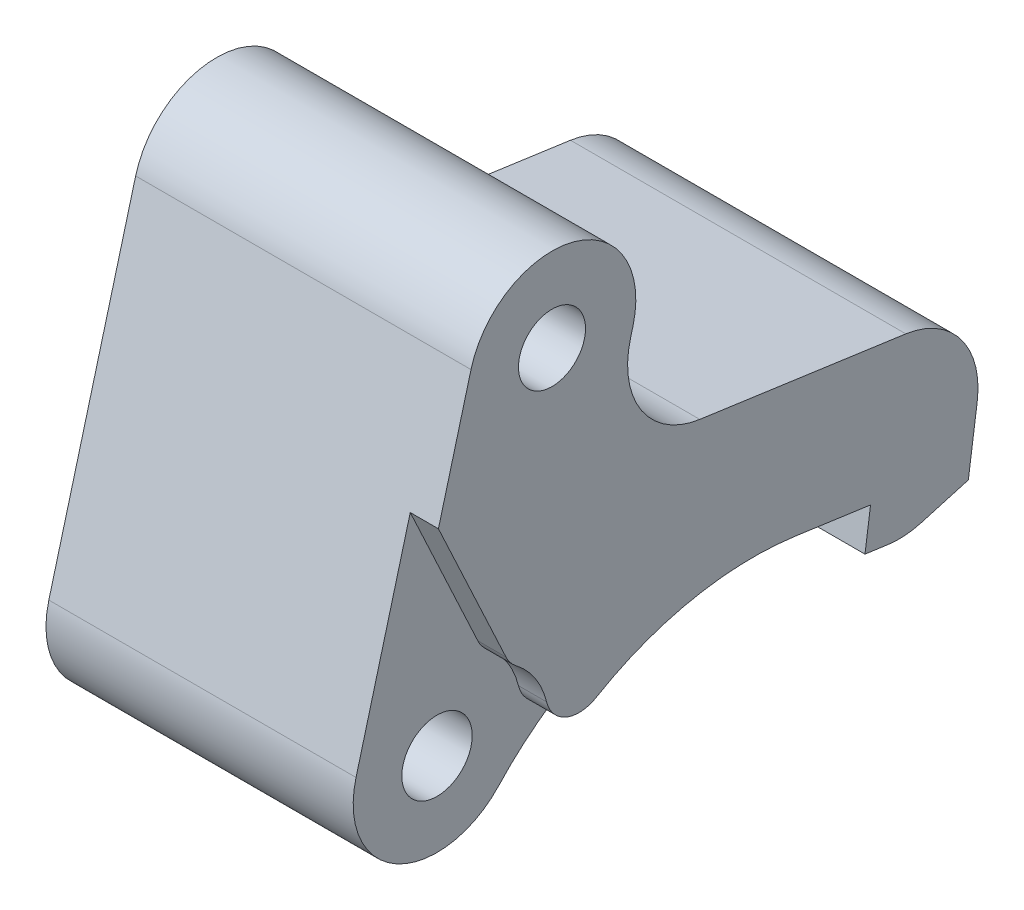
ISO-10303-21;
HEADER;
FILE_DESCRIPTION(('STEP AP214'),'2;1');
FILE_NAME('part.step','',(''),(''),'','','');
FILE_SCHEMA(('AUTOMOTIVE_DESIGN { 1 0 10303 214 1 1 1 1 }'));
ENDSEC;
DATA;
#1=APPLICATION_CONTEXT('core data for automotive mechanical design processes');
#2=APPLICATION_PROTOCOL_DEFINITION('international standard','automotive_design',2000,#1);
#3=PRODUCT_CONTEXT('',#1,'mechanical');
#4=PRODUCT('Part','Part','',(#3));
#5=PRODUCT_RELATED_PRODUCT_CATEGORY('part','',(#4));
#6=PRODUCT_DEFINITION_FORMATION('','',#4);
#7=PRODUCT_DEFINITION_CONTEXT('part definition',#1,'design');
#8=PRODUCT_DEFINITION('design','',#6,#7);
#9=PRODUCT_DEFINITION_SHAPE('','',#8);
#10=(LENGTH_UNIT() NAMED_UNIT(*) SI_UNIT(.MILLI.,.METRE.));
#11=(NAMED_UNIT(*) PLANE_ANGLE_UNIT() SI_UNIT($,.RADIAN.));
#12=(NAMED_UNIT(*) SI_UNIT($,.STERADIAN.) SOLID_ANGLE_UNIT());
#13=UNCERTAINTY_MEASURE_WITH_UNIT(LENGTH_MEASURE(1.E-05),#10,'distance_accuracy_value','');
#14=(GEOMETRIC_REPRESENTATION_CONTEXT(3) GLOBAL_UNCERTAINTY_ASSIGNED_CONTEXT((#13)) GLOBAL_UNIT_ASSIGNED_CONTEXT((#10,
#11,#12)) REPRESENTATION_CONTEXT('',''));
#15=CARTESIAN_POINT('',(0.,0.,0.));
#16=DIRECTION('',(0.,0.,1.));
#17=DIRECTION('',(1.,0.,0.));
#18=AXIS2_PLACEMENT_3D('',#15,#16,#17);
#19=CARTESIAN_POINT('',(-3.175,0.410875234100253,1.5334072492339));
#20=DIRECTION('',(0.,-0.258819045102522,-0.965925826289068));
#21=DIRECTION('',(0.,0.965925826289068,-0.258819045102522));
#22=AXIS2_PLACEMENT_3D('',#19,#20,#21);
#23=PLANE('',#22);
#24=DIRECTION('',(1.,0.,0.));
#25=VECTOR('',#24,1.);
#26=CARTESIAN_POINT('',(2.6416,4.24218771517221,0.50681016397938));
#27=LINE('',#26,#25);
#28=CARTESIAN_POINT('',(2.6416,4.24218771517221,0.50681016397938));
#29=VERTEX_POINT('',#28);
#30=CARTESIAN_POINT('',(3.175,4.24218771517221,0.50681016397938));
#31=VERTEX_POINT('',#30);
#32=EDGE_CURVE('E507',#29,#31,#27,.T.);
#33=ORIENTED_EDGE('',*,*,#32,.T.);
#34=DIRECTION('',(0.,-0.965925826289068,0.258819045102522));
#35=VECTOR('',#34,1.);
#36=CARTESIAN_POINT('',(3.175,0.410875234100253,1.5334072492339));
#37=LINE('',#36,#35);
#38=CARTESIAN_POINT('',(3.175,6.54450423103583,-0.110093687167115));
#39=VERTEX_POINT('',#38);
#40=EDGE_CURVE('E516',#39,#31,#37,.T.);
#41=ORIENTED_EDGE('',*,*,#40,.F.);
#42=DIRECTION('',(1.,0.,0.));
#43=VECTOR('',#42,1.);
#44=CARTESIAN_POINT('',(-3.175,6.54450423103583,-0.110093687167115));
#45=LINE('',#44,#43);
#46=CARTESIAN_POINT('',(-3.175,6.54450423103583,-0.110093687167115));
#47=VERTEX_POINT('',#46);
#48=EDGE_CURVE('E629',#47,#39,#45,.T.);
#49=ORIENTED_EDGE('',*,*,#48,.F.);
#50=DIRECTION('',(0.,-0.965925826289068,0.258819045102522));
#51=VECTOR('',#50,1.);
#52=CARTESIAN_POINT('',(-3.175,0.410875234100253,1.5334072492339));
#53=LINE('',#52,#51);
#54=CARTESIAN_POINT('',(-3.175,0.410875234100253,1.5334072492339));
#55=VERTEX_POINT('',#54);
#56=EDGE_CURVE('E609',#47,#55,#53,.T.);
#57=ORIENTED_EDGE('',*,*,#56,.T.);
#58=DIRECTION('',(1.,0.,0.));
#59=VECTOR('',#58,1.);
#60=CARTESIAN_POINT('',(-3.175,0.410875234100253,1.5334072492339));
#61=LINE('',#60,#59);
#62=CARTESIAN_POINT('',(2.6416,0.410875234100253,1.5334072492339));
#63=VERTEX_POINT('',#62);
#64=EDGE_CURVE('E627',#55,#63,#61,.T.);
#65=ORIENTED_EDGE('',*,*,#64,.T.);
#66=DIRECTION('',(0.,-0.965925826289068,0.258819045102522));
#67=VECTOR('',#66,1.);
#68=CARTESIAN_POINT('',(2.6416,-6.48451425474311,3.38102129426753));
#69=LINE('',#68,#67);
#70=EDGE_CURVE('E531',#29,#63,#69,.T.);
#71=ORIENTED_EDGE('',*,*,#70,.F.);
#72=EDGE_LOOP('',(#33,#41,#49,#57,#65,#71));
#73=FACE_BOUND('',#72,.T.);
#74=ADVANCED_FACE('F372',(#73),#23,.F.);
#75=CARTESIAN_POINT('',(-3.175,0.,0.));
#76=DIRECTION('',(1.,0.,0.));
#77=DIRECTION('',(0.,0.,1.));
#78=AXIS2_PLACEMENT_3D('',#75,#76,#77);
#79=CYLINDRICAL_SURFACE('',#78,1.5875);
#80=CARTESIAN_POINT('',(2.6416,0.,0.));
#81=DIRECTION('',(-1.,0.,0.));
#82=DIRECTION('',(0.,0.,1.));
#83=AXIS2_PLACEMENT_3D('',#80,#81,#82);
#84=CIRCLE('',#83,1.5875);
#85=CARTESIAN_POINT('',(2.6416,-1.07836692311019,-1.16502404659383));
#86=VERTEX_POINT('',#85);
#87=EDGE_CURVE('E672',#86,#63,#84,.T.);
#88=ORIENTED_EDGE('',*,*,#87,.T.);
#89=ORIENTED_EDGE('',*,*,#64,.F.);
#90=CARTESIAN_POINT('',(-3.175,0.,0.));
#91=DIRECTION('',(1.,0.,0.));
#92=DIRECTION('',(0.,0.,1.));
#93=AXIS2_PLACEMENT_3D('',#90,#91,#92);
#94=CIRCLE('',#93,1.5875);
#95=CARTESIAN_POINT('',(-3.175,-1.07836692311019,-1.16502404659383));
#96=VERTEX_POINT('',#95);
#97=EDGE_CURVE('E612',#55,#96,#94,.T.);
#98=ORIENTED_EDGE('',*,*,#97,.T.);
#99=DIRECTION('',(1.,0.,0.));
#100=VECTOR('',#99,1.);
#101=CARTESIAN_POINT('',(-3.175,-1.07836692311019,-1.16502404659383));
#102=LINE('',#101,#100);
#103=EDGE_CURVE('E625',#96,#86,#102,.T.);
#104=ORIENTED_EDGE('',*,*,#103,.T.);
#105=EDGE_LOOP('',(#88,#89,#98,#104));
#106=FACE_BOUND('',#105,.T.);
#107=ADVANCED_FACE('F729',(#106),#79,.T.);
#108=CARTESIAN_POINT('',(-3.175,0.,0.));
#109=DIRECTION('',(1.,0.,0.));
#110=DIRECTION('',(0.,0.,1.));
#111=AXIS2_PLACEMENT_3D('',#108,#109,#110);
#112=CYLINDRICAL_SURFACE('',#111,0.66675);
#113=CARTESIAN_POINT('',(-3.175,0.,0.));
#114=DIRECTION('',(1.,0.,0.));
#115=DIRECTION('',(0.,0.,-1.));
#116=AXIS2_PLACEMENT_3D('',#113,#114,#115);
#117=CIRCLE('',#116,0.66675);
#118=CARTESIAN_POINT('',(-3.175,0.,-0.66675));
#119=VERTEX_POINT('',#118);
#120=EDGE_CURVE('E545',#119,#119,#117,.T.);
#121=ORIENTED_EDGE('',*,*,#120,.F.);
#122=EDGE_LOOP('',(#121));
#123=FACE_BOUND('',#122,.T.);
#124=CARTESIAN_POINT('',(2.6416,0.,0.));
#125=DIRECTION('',(-1.,0.,0.));
#126=DIRECTION('',(0.,0.,1.));
#127=AXIS2_PLACEMENT_3D('',#124,#125,#126);
#128=CIRCLE('',#127,0.66675);
#129=CARTESIAN_POINT('',(2.6416,0.,0.66675));
#130=VERTEX_POINT('',#129);
#131=EDGE_CURVE('E533',#130,#130,#128,.F.);
#132=ORIENTED_EDGE('',*,*,#131,.T.);
#133=EDGE_LOOP('',(#132));
#134=FACE_BOUND('',#133,.T.);
#135=ADVANCED_FACE('F732',(#123,#134),#112,.F.);
#136=CARTESIAN_POINT('',(-3.175,-5.05006825462579,-5.45588966750787));
#137=DIRECTION('',(1.,0.,0.));
#138=DIRECTION('',(0.,0.,1.));
#139=AXIS2_PLACEMENT_3D('',#136,#137,#138);
#140=PLANE('',#139);
#141=ORIENTED_EDGE('',*,*,#120,.T.);
#142=EDGE_LOOP('',(#141));
#143=FACE_BOUND('',#142,.T.);
#144=DIRECTION('',(0.,-0.99026806874157,0.139173100960066));
#145=VECTOR('',#144,1.);
#146=CARTESIAN_POINT('',(-3.175,-0.212280913617617,-7.56957388371306));
#147=LINE('',#146,#145);
#148=CARTESIAN_POINT('',(-3.175,0.542303354763459,-7.67562378664463));
#149=VERTEX_POINT('',#148);
#150=CARTESIAN_POINT('',(-3.175,-0.212280913617617,-7.56957388371306));
#151=VERTEX_POINT('',#150);
#152=EDGE_CURVE('E580',#149,#151,#147,.T.);
#153=ORIENTED_EDGE('',*,*,#152,.F.);
#154=DIRECTION('',(0.,-0.139173100960066,-0.99026806874157));
#155=VECTOR('',#154,1.);
#156=CARTESIAN_POINT('',(-3.175,0.542303354763459,-7.67562378664463));
#157=LINE('',#156,#155);
#158=CARTESIAN_POINT('',(-3.175,0.739904680456058,-6.26961729670853));
#159=VERTEX_POINT('',#158);
#160=EDGE_CURVE('E618',#159,#149,#157,.T.);
#161=ORIENTED_EDGE('',*,*,#160,.F.);
#162=CARTESIAN_POINT('',(-3.175,-5.05006825462579,-5.45588966750787));
#163=DIRECTION('',(-1.,0.,0.));
#164=DIRECTION('',(0.,0.,1.));
#165=AXIS2_PLACEMENT_3D('',#162,#163,#164);
#166=CIRCLE('',#165,5.84687431398221);
#167=EDGE_CURVE('E615',#96,#159,#166,.T.);
#168=ORIENTED_EDGE('',*,*,#167,.F.);
#169=ORIENTED_EDGE('',*,*,#97,.F.);
#170=ORIENTED_EDGE('',*,*,#56,.F.);
#171=CARTESIAN_POINT('',(-3.175,6.13362899693558,-1.64350093640101));
#172=DIRECTION('',(1.,0.,0.));
#173=DIRECTION('',(0.,0.,1.));
#174=AXIS2_PLACEMENT_3D('',#171,#172,#173);
#175=CIRCLE('',#174,1.5875);
#176=CARTESIAN_POINT('',(-3.175,5.72275376283533,-3.17690818563491));
#177=VERTEX_POINT('',#176);
#178=EDGE_CURVE('E607',#177,#47,#175,.T.);
#179=ORIENTED_EDGE('',*,*,#178,.F.);
#180=DIRECTION('',(0.,0.965925826289068,-0.258819045102523));
#181=VECTOR('',#180,1.);
#182=CARTESIAN_POINT('',(-3.175,5.72275376283533,-3.17690818563491));
#183=LINE('',#182,#181);
#184=CARTESIAN_POINT('',(-3.175,5.54469413958629,-3.12919725338073));
#185=VERTEX_POINT('',#184);
#186=EDGE_CURVE('E604',#185,#177,#183,.T.);
#187=ORIENTED_EDGE('',*,*,#186,.F.);
#188=CARTESIAN_POINT('',(-3.175,5.13381890548603,-4.66260450261463));
#189=DIRECTION('',(-1.,0.,0.));
#190=DIRECTION('',(0.,0.,-1.));
#191=AXIS2_PLACEMENT_3D('',#188,#189,#190);
#192=CIRCLE('',#191,1.5875);
#193=CARTESIAN_POINT('',(-3.175,3.56176834635879,-4.44166720484053));
#194=VERTEX_POINT('',#193);
#195=EDGE_CURVE('E601',#194,#185,#192,.T.);
#196=ORIENTED_EDGE('',*,*,#195,.F.);
#197=DIRECTION('',(0.,0.139173100960065,0.99026806874157));
#198=VECTOR('',#197,1.);
#199=CARTESIAN_POINT('',(-3.175,3.01339678981223,-8.34353357490864));
#200=LINE('',#199,#198);
#201=CARTESIAN_POINT('',(-3.175,3.01339678981223,-8.34353357490864));
#202=VERTEX_POINT('',#201);
#203=EDGE_CURVE('E598',#202,#194,#200,.T.);
#204=ORIENTED_EDGE('',*,*,#203,.F.);
#205=CARTESIAN_POINT('',(-3.175,1.44134623068498,-8.12259627713454));
#206=DIRECTION('',(1.,0.,0.));
#207=DIRECTION('',(0.,0.,-1.));
#208=AXIS2_PLACEMENT_3D('',#205,#206,#207);
#209=CIRCLE('',#208,1.5875);
#210=CARTESIAN_POINT('',(-3.175,1.22040893291088,-9.69464683626178));
#211=VERTEX_POINT('',#210);
#212=EDGE_CURVE('E595',#211,#202,#209,.T.);
#213=ORIENTED_EDGE('',*,*,#212,.F.);
#214=DIRECTION('',(0.,0.99026806874157,-0.139173100960068));
#215=VECTOR('',#214,1.);
#216=CARTESIAN_POINT('',(-3.175,0.0256505079741748,-9.52673448995346));
#217=LINE('',#216,#215);
#218=CARTESIAN_POINT('',(-3.175,0.0256505079741748,-9.52673448995346));
#219=VERTEX_POINT('',#218);
#220=EDGE_CURVE('E592',#219,#211,#217,.T.);
#221=ORIENTED_EDGE('',*,*,#220,.F.);
#222=DIRECTION('',(0.,0.275007967505811,-0.961441947185748));
#223=VECTOR('',#222,1.);
#224=CARTESIAN_POINT('',(-3.175,-0.229389163556524,-8.63510272877219));
#225=LINE('',#224,#223);
#226=CARTESIAN_POINT('',(-3.175,-0.229389163556524,-8.63510272877219));
#227=VERTEX_POINT('',#226);
#228=EDGE_CURVE('E589',#227,#219,#225,.T.);
#229=ORIENTED_EDGE('',*,*,#228,.F.);
#230=CARTESIAN_POINT('',(-3.175,1.23584836395456,-8.21599058629334));
#231=DIRECTION('',(1.,0.,0.));
#232=DIRECTION('',(0.,0.,1.));
#233=AXIS2_PLACEMENT_3D('',#230,#231,#232);
#234=CIRCLE('',#233,1.524);
#235=CARTESIAN_POINT('',(-3.175,-0.273320172807596,-8.00389078043019));
#236=VERTEX_POINT('',#235);
#237=EDGE_CURVE('E586',#236,#227,#234,.T.);
#238=ORIENTED_EDGE('',*,*,#237,.F.);
#239=DIRECTION('',(0.,-0.139173100960065,-0.99026806874157));
#240=VECTOR('',#239,1.);
#241=CARTESIAN_POINT('',(-3.175,-0.212280913617617,-7.56957388371306));
#242=LINE('',#241,#240);
#243=EDGE_CURVE('E583',#151,#236,#242,.T.);
#244=ORIENTED_EDGE('',*,*,#243,.F.);
#245=EDGE_LOOP('',(#153,#161,#168,#169,#170,#179,#187,#196,#204,#213,#221,#229,#238,#244));
#246=FACE_BOUND('',#245,.T.);
#247=CARTESIAN_POINT('',(-3.175,6.13362899693558,-1.64350093640101));
#248=DIRECTION('',(1.,0.,0.));
#249=DIRECTION('',(0.,0.,-1.));
#250=AXIS2_PLACEMENT_3D('',#247,#248,#249);
#251=CIRCLE('',#250,0.635);
#252=CARTESIAN_POINT('',(-3.175,6.13362899693558,-2.27850093640101));
#253=VERTEX_POINT('',#252);
#254=EDGE_CURVE('E536',#253,#253,#251,.T.);
#255=ORIENTED_EDGE('',*,*,#254,.T.);
#256=EDGE_LOOP('',(#255));
#257=FACE_BOUND('',#256,.T.);
#258=ADVANCED_FACE('F726',(#143,#246,#257),#140,.F.);
#259=CARTESIAN_POINT('',(3.175,-5.05006825462579,-5.45588966750787));
#260=DIRECTION('',(1.,0.,0.));
#261=DIRECTION('',(0.,0.,1.));
#262=AXIS2_PLACEMENT_3D('',#259,#260,#261);
#263=PLANE('',#262);
#264=CARTESIAN_POINT('',(3.175,0.,0.));
#265=DIRECTION('',(-1.,0.,0.));
#266=DIRECTION('',(0.,0.,1.));
#267=AXIS2_PLACEMENT_3D('',#264,#265,#266);
#268=CIRCLE('',#267,1.5875);
#269=CARTESIAN_POINT('',(3.175,1.26214979665106,-0.962878050852599));
#270=VERTEX_POINT('',#269);
#271=CARTESIAN_POINT('',(3.175,0.378793083935583,-1.54164588980822));
#272=VERTEX_POINT('',#271);
#273=EDGE_CURVE('E513',#270,#272,#268,.T.);
#274=ORIENTED_EDGE('',*,*,#273,.T.);
#275=CARTESIAN_POINT('',(3.175,0.530310317509816,-2.15830424573151));
#276=DIRECTION('',(-1.,0.,0.));
#277=DIRECTION('',(0.,0.,1.));
#278=AXIS2_PLACEMENT_3D('',#275,#276,#277);
#279=CIRCLE('',#278,0.635);
#280=CARTESIAN_POINT('',(3.175,-0.0163742094737226,-2.48135382080751));
#281=VERTEX_POINT('',#280);
#282=EDGE_CURVE('E653',#281,#272,#279,.T.);
#283=ORIENTED_EDGE('',*,*,#282,.F.);
#284=CARTESIAN_POINT('',(3.175,-5.05006825462579,-5.45588966750787));
#285=DIRECTION('',(-1.,0.,0.));
#286=DIRECTION('',(0.,0.,1.));
#287=AXIS2_PLACEMENT_3D('',#284,#285,#286);
#288=CIRCLE('',#287,5.84687431398221);
#289=CARTESIAN_POINT('',(3.175,0.739904680456058,-6.26961729670853));
#290=VERTEX_POINT('',#289);
#291=EDGE_CURVE('E526',#281,#290,#288,.T.);
#292=ORIENTED_EDGE('',*,*,#291,.T.);
#293=DIRECTION('',(0.,-0.139173100960066,-0.99026806874157));
#294=VECTOR('',#293,1.);
#295=CARTESIAN_POINT('',(3.175,0.542303354763459,-7.67562378664463));
#296=LINE('',#295,#294);
#297=CARTESIAN_POINT('',(3.175,0.542303354763459,-7.67562378664463));
#298=VERTEX_POINT('',#297);
#299=EDGE_CURVE('E577',#290,#298,#296,.T.);
#300=ORIENTED_EDGE('',*,*,#299,.T.);
#301=DIRECTION('',(0.,-0.99026806874157,0.139173100960066));
#302=VECTOR('',#301,1.);
#303=CARTESIAN_POINT('',(3.175,-0.212280913617617,-7.56957388371306));
#304=LINE('',#303,#302);
#305=CARTESIAN_POINT('',(3.175,-0.212280913617617,-7.56957388371306));
#306=VERTEX_POINT('',#305);
#307=EDGE_CURVE('E548',#298,#306,#304,.T.);
#308=ORIENTED_EDGE('',*,*,#307,.T.);
#309=DIRECTION('',(0.,-0.139173100960065,-0.99026806874157));
#310=VECTOR('',#309,1.);
#311=CARTESIAN_POINT('',(3.175,-0.212280913617617,-7.56957388371306));
#312=LINE('',#311,#310);
#313=CARTESIAN_POINT('',(3.175,-0.273320172807596,-8.00389078043019));
#314=VERTEX_POINT('',#313);
#315=EDGE_CURVE('E551',#306,#314,#312,.T.);
#316=ORIENTED_EDGE('',*,*,#315,.T.);
#317=CARTESIAN_POINT('',(3.175,1.23584836395456,-8.21599058629334));
#318=DIRECTION('',(1.,0.,0.));
#319=DIRECTION('',(0.,0.,1.));
#320=AXIS2_PLACEMENT_3D('',#317,#318,#319);
#321=CIRCLE('',#320,1.524);
#322=CARTESIAN_POINT('',(3.175,-0.229389163556524,-8.63510272877219));
#323=VERTEX_POINT('',#322);
#324=EDGE_CURVE('E554',#314,#323,#321,.T.);
#325=ORIENTED_EDGE('',*,*,#324,.T.);
#326=DIRECTION('',(0.,0.275007967505811,-0.961441947185748));
#327=VECTOR('',#326,1.);
#328=CARTESIAN_POINT('',(3.175,-0.229389163556524,-8.63510272877219));
#329=LINE('',#328,#327);
#330=CARTESIAN_POINT('',(3.175,0.0256505079741748,-9.52673448995346));
#331=VERTEX_POINT('',#330);
#332=EDGE_CURVE('E557',#323,#331,#329,.T.);
#333=ORIENTED_EDGE('',*,*,#332,.T.);
#334=DIRECTION('',(0.,0.99026806874157,-0.139173100960068));
#335=VECTOR('',#334,1.);
#336=CARTESIAN_POINT('',(3.175,0.0256505079741748,-9.52673448995346));
#337=LINE('',#336,#335);
#338=CARTESIAN_POINT('',(3.175,1.22040893291088,-9.69464683626178));
#339=VERTEX_POINT('',#338);
#340=EDGE_CURVE('E560',#331,#339,#337,.T.);
#341=ORIENTED_EDGE('',*,*,#340,.T.);
#342=CARTESIAN_POINT('',(3.175,1.44134623068498,-8.12259627713454));
#343=DIRECTION('',(1.,0.,0.));
#344=DIRECTION('',(0.,0.,-1.));
#345=AXIS2_PLACEMENT_3D('',#342,#343,#344);
#346=CIRCLE('',#345,1.5875);
#347=CARTESIAN_POINT('',(3.175,3.01339678981223,-8.34353357490864));
#348=VERTEX_POINT('',#347);
#349=EDGE_CURVE('E563',#339,#348,#346,.T.);
#350=ORIENTED_EDGE('',*,*,#349,.T.);
#351=DIRECTION('',(0.,0.139173100960065,0.99026806874157));
#352=VECTOR('',#351,1.);
#353=CARTESIAN_POINT('',(3.175,3.01339678981223,-8.34353357490864));
#354=LINE('',#353,#352);
#355=CARTESIAN_POINT('',(3.175,3.56176834635879,-4.44166720484053));
#356=VERTEX_POINT('',#355);
#357=EDGE_CURVE('E566',#348,#356,#354,.T.);
#358=ORIENTED_EDGE('',*,*,#357,.T.);
#359=CARTESIAN_POINT('',(3.175,5.13381890548603,-4.66260450261463));
#360=DIRECTION('',(-1.,0.,0.));
#361=DIRECTION('',(0.,0.,-1.));
#362=AXIS2_PLACEMENT_3D('',#359,#360,#361);
#363=CIRCLE('',#362,1.5875);
#364=CARTESIAN_POINT('',(3.175,5.54469413958629,-3.12919725338073));
#365=VERTEX_POINT('',#364);
#366=EDGE_CURVE('E569',#356,#365,#363,.T.);
#367=ORIENTED_EDGE('',*,*,#366,.T.);
#368=DIRECTION('',(0.,0.965925826289068,-0.258819045102523));
#369=VECTOR('',#368,1.);
#370=CARTESIAN_POINT('',(3.175,5.72275376283533,-3.17690818563491));
#371=LINE('',#370,#369);
#372=CARTESIAN_POINT('',(3.175,5.72275376283533,-3.17690818563491));
#373=VERTEX_POINT('',#372);
#374=EDGE_CURVE('E572',#365,#373,#371,.T.);
#375=ORIENTED_EDGE('',*,*,#374,.T.);
#376=CARTESIAN_POINT('',(3.175,6.13362899693558,-1.64350093640101));
#377=DIRECTION('',(1.,0.,0.));
#378=DIRECTION('',(0.,0.,1.));
#379=AXIS2_PLACEMENT_3D('',#376,#377,#378);
#380=CIRCLE('',#379,1.5875);
#381=EDGE_CURVE('E522',#373,#39,#380,.T.);
#382=ORIENTED_EDGE('',*,*,#381,.T.);
#383=ORIENTED_EDGE('',*,*,#40,.T.);
#384=DIRECTION('',(0.,0.90630778703665,0.4226182617407));
#385=VECTOR('',#384,1.);
#386=CARTESIAN_POINT('',(3.175,-7.63277467782722,-5.03057574017888));
#387=LINE('',#386,#385);
#388=CARTESIAN_POINT('',(3.175,1.49864711910613,-0.772523826425365));
#389=VERTEX_POINT('',#388);
#390=EDGE_CURVE('E502',#389,#31,#387,.T.);
#391=ORIENTED_EDGE('',*,*,#390,.F.);
#392=CARTESIAN_POINT('',(3.175,1.76700971531148,-1.34802927119364));
#393=DIRECTION('',(-1.,0.,0.));
#394=DIRECTION('',(0.,0.,1.));
#395=AXIS2_PLACEMENT_3D('',#392,#393,#394);
#396=CIRCLE('',#395,0.635);
#397=EDGE_CURVE('E656',#270,#389,#396,.T.);
#398=ORIENTED_EDGE('',*,*,#397,.F.);
#399=EDGE_LOOP('',(#274,#283,#292,#300,#308,#316,#325,#333,#341,#350,#358,#367,#375,#382,#383,
#391,#398));
#400=FACE_BOUND('',#399,.T.);
#401=CARTESIAN_POINT('',(3.175,6.13362899693558,-1.64350093640101));
#402=DIRECTION('',(1.,0.,0.));
#403=DIRECTION('',(0.,0.,-1.));
#404=AXIS2_PLACEMENT_3D('',#401,#402,#403);
#405=CIRCLE('',#404,0.635);
#406=CARTESIAN_POINT('',(3.175,6.13362899693558,-2.27850093640101));
#407=VERTEX_POINT('',#406);
#408=EDGE_CURVE('E532',#407,#407,#405,.T.);
#409=ORIENTED_EDGE('',*,*,#408,.F.);
#410=EDGE_LOOP('',(#409));
#411=FACE_BOUND('',#410,.T.);
#412=ADVANCED_FACE('F518',(#400,#411),#263,.T.);
#413=CARTESIAN_POINT('',(-3.175,-0.212280913617617,-7.56957388371306));
#414=DIRECTION('',(0.,-0.139173100960066,-0.99026806874157));
#415=DIRECTION('',(0.,0.99026806874157,-0.139173100960066));
#416=AXIS2_PLACEMENT_3D('',#413,#414,#415);
#417=PLANE('',#416);
#418=ORIENTED_EDGE('',*,*,#307,.F.);
#419=DIRECTION('',(1.,0.,0.));
#420=VECTOR('',#419,1.);
#421=CARTESIAN_POINT('',(-3.175,0.542303354763459,-7.67562378664463));
#422=LINE('',#421,#420);
#423=EDGE_CURVE('E621',#149,#298,#422,.T.);
#424=ORIENTED_EDGE('',*,*,#423,.F.);
#425=ORIENTED_EDGE('',*,*,#152,.T.);
#426=DIRECTION('',(1.,0.,0.));
#427=VECTOR('',#426,1.);
#428=CARTESIAN_POINT('',(-3.175,-0.212280913617617,-7.56957388371306));
#429=LINE('',#428,#427);
#430=EDGE_CURVE('E647',#151,#306,#429,.T.);
#431=ORIENTED_EDGE('',*,*,#430,.T.);
#432=EDGE_LOOP('',(#418,#424,#425,#431));
#433=FACE_BOUND('',#432,.T.);
#434=ADVANCED_FACE('F374',(#433),#417,.F.);
#435=CARTESIAN_POINT('',(-3.175,-0.212280913617617,-7.56957388371306));
#436=DIRECTION('',(0.,0.99026806874157,-0.139173100960065));
#437=DIRECTION('',(0.,0.139173100960065,0.99026806874157));
#438=AXIS2_PLACEMENT_3D('',#435,#436,#437);
#439=PLANE('',#438);
#440=ORIENTED_EDGE('',*,*,#315,.F.);
#441=ORIENTED_EDGE('',*,*,#430,.F.);
#442=ORIENTED_EDGE('',*,*,#243,.T.);
#443=DIRECTION('',(1.,0.,0.));
#444=VECTOR('',#443,1.);
#445=CARTESIAN_POINT('',(-3.175,-0.273320172807596,-8.00389078043019));
#446=LINE('',#445,#444);
#447=EDGE_CURVE('E645',#236,#314,#446,.T.);
#448=ORIENTED_EDGE('',*,*,#447,.T.);
#449=EDGE_LOOP('',(#440,#441,#442,#448));
#450=FACE_BOUND('',#449,.T.);
#451=ADVANCED_FACE('F691',(#450),#439,.F.);
#452=CARTESIAN_POINT('',(-3.175,1.23584836395456,-8.21599058629334));
#453=DIRECTION('',(1.,0.,0.));
#454=DIRECTION('',(0.,0.,1.));
#455=AXIS2_PLACEMENT_3D('',#452,#453,#454);
#456=CYLINDRICAL_SURFACE('',#455,1.524);
#457=ORIENTED_EDGE('',*,*,#324,.F.);
#458=ORIENTED_EDGE('',*,*,#447,.F.);
#459=ORIENTED_EDGE('',*,*,#237,.T.);
#460=DIRECTION('',(1.,0.,0.));
#461=VECTOR('',#460,1.);
#462=CARTESIAN_POINT('',(-3.175,-0.229389163556524,-8.63510272877219));
#463=LINE('',#462,#461);
#464=EDGE_CURVE('E643',#227,#323,#463,.T.);
#465=ORIENTED_EDGE('',*,*,#464,.T.);
#466=EDGE_LOOP('',(#457,#458,#459,#465));
#467=FACE_BOUND('',#466,.T.);
#468=ADVANCED_FACE('F695',(#467),#456,.T.);
#469=CARTESIAN_POINT('',(-3.175,-0.229389163556524,-8.63510272877219));
#470=DIRECTION('',(0.,0.961441947185748,0.275007967505811));
#471=DIRECTION('',(0.,-0.275007967505811,0.961441947185748));
#472=AXIS2_PLACEMENT_3D('',#469,#470,#471);
#473=PLANE('',#472);
#474=ORIENTED_EDGE('',*,*,#332,.F.);
#475=ORIENTED_EDGE('',*,*,#464,.F.);
#476=ORIENTED_EDGE('',*,*,#228,.T.);
#477=DIRECTION('',(1.,0.,0.));
#478=VECTOR('',#477,1.);
#479=CARTESIAN_POINT('',(-3.175,0.0256505079741748,-9.52673448995346));
#480=LINE('',#479,#478);
#481=EDGE_CURVE('E641',#219,#331,#480,.T.);
#482=ORIENTED_EDGE('',*,*,#481,.T.);
#483=EDGE_LOOP('',(#474,#475,#476,#482));
#484=FACE_BOUND('',#483,.T.);
#485=ADVANCED_FACE('F699',(#484),#473,.F.);
#486=CARTESIAN_POINT('',(-3.175,0.0256505079741748,-9.52673448995346));
#487=DIRECTION('',(0.,0.139173100960068,0.99026806874157));
#488=DIRECTION('',(0.,-0.99026806874157,0.139173100960068));
#489=AXIS2_PLACEMENT_3D('',#486,#487,#488);
#490=PLANE('',#489);
#491=ORIENTED_EDGE('',*,*,#340,.F.);
#492=ORIENTED_EDGE('',*,*,#481,.F.);
#493=ORIENTED_EDGE('',*,*,#220,.T.);
#494=DIRECTION('',(1.,0.,0.));
#495=VECTOR('',#494,1.);
#496=CARTESIAN_POINT('',(-3.175,1.22040893291088,-9.69464683626178));
#497=LINE('',#496,#495);
#498=EDGE_CURVE('E639',#211,#339,#497,.T.);
#499=ORIENTED_EDGE('',*,*,#498,.T.);
#500=EDGE_LOOP('',(#491,#492,#493,#499));
#501=FACE_BOUND('',#500,.T.);
#502=ADVANCED_FACE('F703',(#501),#490,.F.);
#503=CARTESIAN_POINT('',(-3.175,1.44134623068498,-8.12259627713454));
#504=DIRECTION('',(1.,0.,0.));
#505=DIRECTION('',(0.,0.,1.));
#506=AXIS2_PLACEMENT_3D('',#503,#504,#505);
#507=CYLINDRICAL_SURFACE('',#506,1.5875);
#508=ORIENTED_EDGE('',*,*,#349,.F.);
#509=ORIENTED_EDGE('',*,*,#498,.F.);
#510=ORIENTED_EDGE('',*,*,#212,.T.);
#511=DIRECTION('',(1.,0.,0.));
#512=VECTOR('',#511,1.);
#513=CARTESIAN_POINT('',(-3.175,3.01339678981223,-8.34353357490864));
#514=LINE('',#513,#512);
#515=EDGE_CURVE('E637',#202,#348,#514,.T.);
#516=ORIENTED_EDGE('',*,*,#515,.T.);
#517=EDGE_LOOP('',(#508,#509,#510,#516));
#518=FACE_BOUND('',#517,.T.);
#519=ADVANCED_FACE('F707',(#518),#507,.T.);
#520=CARTESIAN_POINT('',(-3.175,3.01339678981223,-8.34353357490864));
#521=DIRECTION('',(0.,-0.99026806874157,0.139173100960065));
#522=DIRECTION('',(0.,-0.139173100960065,-0.99026806874157));
#523=AXIS2_PLACEMENT_3D('',#520,#521,#522);
#524=PLANE('',#523);
#525=ORIENTED_EDGE('',*,*,#357,.F.);
#526=ORIENTED_EDGE('',*,*,#515,.F.);
#527=ORIENTED_EDGE('',*,*,#203,.T.);
#528=DIRECTION('',(1.,0.,0.));
#529=VECTOR('',#528,1.);
#530=CARTESIAN_POINT('',(-3.175,3.56176834635879,-4.44166720484053));
#531=LINE('',#530,#529);
#532=EDGE_CURVE('E635',#194,#356,#531,.T.);
#533=ORIENTED_EDGE('',*,*,#532,.T.);
#534=EDGE_LOOP('',(#525,#526,#527,#533));
#535=FACE_BOUND('',#534,.T.);
#536=ADVANCED_FACE('F711',(#535),#524,.F.);
#537=CARTESIAN_POINT('',(-3.175,5.13381890548603,-4.66260450261463));
#538=DIRECTION('',(1.,0.,0.));
#539=DIRECTION('',(0.,0.,1.));
#540=AXIS2_PLACEMENT_3D('',#537,#538,#539);
#541=CYLINDRICAL_SURFACE('',#540,1.5875);
#542=ORIENTED_EDGE('',*,*,#366,.F.);
#543=ORIENTED_EDGE('',*,*,#532,.F.);
#544=ORIENTED_EDGE('',*,*,#195,.T.);
#545=DIRECTION('',(1.,0.,0.));
#546=VECTOR('',#545,1.);
#547=CARTESIAN_POINT('',(-3.175,5.54469413958629,-3.12919725338073));
#548=LINE('',#547,#546);
#549=EDGE_CURVE('E633',#185,#365,#548,.T.);
#550=ORIENTED_EDGE('',*,*,#549,.T.);
#551=EDGE_LOOP('',(#542,#543,#544,#550));
#552=FACE_BOUND('',#551,.T.);
#553=ADVANCED_FACE('F715',(#552),#541,.F.);
#554=CARTESIAN_POINT('',(-3.175,5.72275376283533,-3.17690818563491));
#555=DIRECTION('',(0.,0.258819045102523,0.965925826289068));
#556=DIRECTION('',(0.,-0.965925826289068,0.258819045102523));
#557=AXIS2_PLACEMENT_3D('',#554,#555,#556);
#558=PLANE('',#557);
#559=ORIENTED_EDGE('',*,*,#374,.F.);
#560=ORIENTED_EDGE('',*,*,#549,.F.);
#561=ORIENTED_EDGE('',*,*,#186,.T.);
#562=DIRECTION('',(1.,0.,0.));
#563=VECTOR('',#562,1.);
#564=CARTESIAN_POINT('',(-3.175,5.72275376283533,-3.17690818563491));
#565=LINE('',#564,#563);
#566=EDGE_CURVE('E631',#177,#373,#565,.T.);
#567=ORIENTED_EDGE('',*,*,#566,.T.);
#568=EDGE_LOOP('',(#559,#560,#561,#567));
#569=FACE_BOUND('',#568,.T.);
#570=ADVANCED_FACE('F719',(#569),#558,.F.);
#571=CARTESIAN_POINT('',(-3.175,6.13362899693558,-1.64350093640101));
#572=DIRECTION('',(1.,0.,0.));
#573=DIRECTION('',(0.,0.,1.));
#574=AXIS2_PLACEMENT_3D('',#571,#572,#573);
#575=CYLINDRICAL_SURFACE('',#574,1.5875);
#576=ORIENTED_EDGE('',*,*,#381,.F.);
#577=ORIENTED_EDGE('',*,*,#566,.F.);
#578=ORIENTED_EDGE('',*,*,#178,.T.);
#579=ORIENTED_EDGE('',*,*,#48,.T.);
#580=EDGE_LOOP('',(#576,#577,#578,#579));
#581=FACE_BOUND('',#580,.T.);
#582=ADVANCED_FACE('F722',(#581),#575,.T.);
#583=CARTESIAN_POINT('',(-3.175,-5.05006825462579,-5.45588966750787));
#584=DIRECTION('',(1.,0.,0.));
#585=DIRECTION('',(0.,0.,1.));
#586=AXIS2_PLACEMENT_3D('',#583,#584,#585);
#587=CYLINDRICAL_SURFACE('',#586,5.84687431398221);
#588=CARTESIAN_POINT('',(2.6416,-5.05006825462579,-5.45588966750787));
#589=DIRECTION('',(-1.,0.,0.));
#590=DIRECTION('',(0.,0.,1.));
#591=AXIS2_PLACEMENT_3D('',#588,#589,#590);
#592=CIRCLE('',#591,5.84687431398221);
#593=CARTESIAN_POINT('',(2.6416,-0.0163742094737228,-2.48135382080751));
#594=VERTEX_POINT('',#593);
#595=EDGE_CURVE('E387',#86,#594,#592,.T.);
#596=ORIENTED_EDGE('',*,*,#595,.F.);
#597=ORIENTED_EDGE('',*,*,#103,.F.);
#598=ORIENTED_EDGE('',*,*,#167,.T.);
#599=DIRECTION('',(1.,0.,0.));
#600=VECTOR('',#599,1.);
#601=CARTESIAN_POINT('',(-3.175,0.739904680456058,-6.26961729670853));
#602=LINE('',#601,#600);
#603=EDGE_CURVE('E623',#159,#290,#602,.T.);
#604=ORIENTED_EDGE('',*,*,#603,.T.);
#605=ORIENTED_EDGE('',*,*,#291,.F.);
#606=DIRECTION('',(1.,0.,0.));
#607=VECTOR('',#606,1.);
#608=CARTESIAN_POINT('',(-3.175,-0.0163742094737226,-2.48135382080751));
#609=LINE('',#608,#607);
#610=EDGE_CURVE('E660',#594,#281,#609,.T.);
#611=ORIENTED_EDGE('',*,*,#610,.F.);
#612=EDGE_LOOP('',(#596,#597,#598,#604,#605,#611));
#613=FACE_BOUND('',#612,.T.);
#614=ADVANCED_FACE('F680',(#613),#587,.F.);
#615=CARTESIAN_POINT('',(-3.175,0.542303354763459,-7.67562378664463));
#616=DIRECTION('',(0.,0.99026806874157,-0.139173100960066));
#617=DIRECTION('',(0.,0.139173100960066,0.99026806874157));
#618=AXIS2_PLACEMENT_3D('',#615,#616,#617);
#619=PLANE('',#618);
#620=ORIENTED_EDGE('',*,*,#299,.F.);
#621=ORIENTED_EDGE('',*,*,#603,.F.);
#622=ORIENTED_EDGE('',*,*,#160,.T.);
#623=ORIENTED_EDGE('',*,*,#423,.T.);
#624=EDGE_LOOP('',(#620,#621,#622,#623));
#625=FACE_BOUND('',#624,.T.);
#626=ADVANCED_FACE('F684',(#625),#619,.F.);
#627=CARTESIAN_POINT('',(-3.175,6.13362899693558,-1.64350093640101));
#628=DIRECTION('',(1.,0.,0.));
#629=DIRECTION('',(0.,0.,1.));
#630=AXIS2_PLACEMENT_3D('',#627,#628,#629);
#631=CYLINDRICAL_SURFACE('',#630,0.635);
#632=ORIENTED_EDGE('',*,*,#254,.F.);
#633=EDGE_LOOP('',(#632));
#634=FACE_BOUND('',#633,.T.);
#635=ORIENTED_EDGE('',*,*,#408,.T.);
#636=EDGE_LOOP('',(#635));
#637=FACE_BOUND('',#636,.T.);
#638=ADVANCED_FACE('F774',(#634,#637),#631,.F.);
#639=CARTESIAN_POINT('',(2.6416,0.,0.));
#640=DIRECTION('',(1.,0.,0.));
#641=DIRECTION('',(0.,0.,1.));
#642=AXIS2_PLACEMENT_3D('',#639,#640,#641);
#643=CYLINDRICAL_SURFACE('',#642,1.5875);
#644=CARTESIAN_POINT('',(2.6416,1.26214979665106,-0.962878050852599));
#645=VERTEX_POINT('',#644);
#646=CARTESIAN_POINT('',(2.6416,0.378793083935583,-1.54164588980822));
#647=VERTEX_POINT('',#646);
#648=EDGE_CURVE('E539',#645,#647,#84,.T.);
#649=ORIENTED_EDGE('',*,*,#648,.T.);
#650=DIRECTION('',(1.,0.,0.));
#651=VECTOR('',#650,1.);
#652=CARTESIAN_POINT('',(2.6416,0.378793083935583,-1.54164588980822));
#653=LINE('',#652,#651);
#654=EDGE_CURVE('E649',#272,#647,#653,.F.);
#655=ORIENTED_EDGE('',*,*,#654,.F.);
#656=ORIENTED_EDGE('',*,*,#273,.F.);
#657=DIRECTION('',(1.,0.,0.));
#658=VECTOR('',#657,1.);
#659=CARTESIAN_POINT('',(2.6416,1.26214979665106,-0.962878050852599));
#660=LINE('',#659,#658);
#661=EDGE_CURVE('E651',#645,#270,#660,.T.);
#662=ORIENTED_EDGE('',*,*,#661,.F.);
#663=EDGE_LOOP('',(#649,#655,#656,#662));
#664=FACE_BOUND('',#663,.T.);
#665=ADVANCED_FACE('F669',(#664),#643,.F.);
#666=CARTESIAN_POINT('',(2.6416,-7.63277467782722,-5.03057574017888));
#667=DIRECTION('',(0.,-0.4226182617407,0.90630778703665));
#668=DIRECTION('',(0.,-0.90630778703665,-0.4226182617407));
#669=AXIS2_PLACEMENT_3D('',#666,#667,#668);
#670=PLANE('',#669);
#671=ORIENTED_EDGE('',*,*,#390,.T.);
#672=ORIENTED_EDGE('',*,*,#32,.F.);
#673=DIRECTION('',(0.,0.90630778703665,0.4226182617407));
#674=VECTOR('',#673,1.);
#675=CARTESIAN_POINT('',(2.6416,-7.63277467782722,-5.03057574017888));
#676=LINE('',#675,#674);
#677=CARTESIAN_POINT('',(2.6416,1.49864711910613,-0.772523826425365));
#678=VERTEX_POINT('',#677);
#679=EDGE_CURVE('E673',#678,#29,#676,.T.);
#680=ORIENTED_EDGE('',*,*,#679,.F.);
#681=DIRECTION('',(-1.,0.,0.));
#682=VECTOR('',#681,1.);
#683=CARTESIAN_POINT('',(2.6416,1.49864711910613,-0.772523826425366));
#684=LINE('',#683,#682);
#685=EDGE_CURVE('E509',#389,#678,#684,.T.);
#686=ORIENTED_EDGE('',*,*,#685,.F.);
#687=EDGE_LOOP('',(#671,#672,#680,#686));
#688=FACE_BOUND('',#687,.T.);
#689=ADVANCED_FACE('F504',(#688),#670,.T.);
#690=CARTESIAN_POINT('',(2.6416,-8.33492566248626,-3.52480809433496));
#691=DIRECTION('',(1.,0.,0.));
#692=DIRECTION('',(0.,0.,1.));
#693=AXIS2_PLACEMENT_3D('',#690,#691,#692);
#694=PLANE('',#693);
#695=ORIENTED_EDGE('',*,*,#70,.T.);
#696=ORIENTED_EDGE('',*,*,#87,.F.);
#697=ORIENTED_EDGE('',*,*,#595,.T.);
#698=CARTESIAN_POINT('',(2.6416,0.530310317509816,-2.15830424573151));
#699=DIRECTION('',(-1.,0.,0.));
#700=DIRECTION('',(0.,0.,1.));
#701=AXIS2_PLACEMENT_3D('',#698,#699,#700);
#702=CIRCLE('',#701,0.635);
#703=EDGE_CURVE('E11',#647,#594,#702,.F.);
#704=ORIENTED_EDGE('',*,*,#703,.F.);
#705=ORIENTED_EDGE('',*,*,#648,.F.);
#706=CARTESIAN_POINT('',(2.6416,1.76700971531148,-1.34802927119364));
#707=DIRECTION('',(-1.,0.,0.));
#708=DIRECTION('',(0.,0.,1.));
#709=AXIS2_PLACEMENT_3D('',#706,#707,#708);
#710=CIRCLE('',#709,0.635);
#711=EDGE_CURVE('E380',#678,#645,#710,.F.);
#712=ORIENTED_EDGE('',*,*,#711,.F.);
#713=ORIENTED_EDGE('',*,*,#679,.T.);
#714=EDGE_LOOP('',(#695,#696,#697,#704,#705,#712,#713));
#715=FACE_BOUND('',#714,.T.);
#716=ORIENTED_EDGE('',*,*,#131,.F.);
#717=EDGE_LOOP('',(#716));
#718=FACE_BOUND('',#717,.T.);
#719=ADVANCED_FACE('F670',(#715,#718),#694,.T.);
#720=CARTESIAN_POINT('',(2.6416,1.76700971531148,-1.34802927119364));
#721=DIRECTION('',(1.,0.,0.));
#722=DIRECTION('',(0.,0.,1.));
#723=AXIS2_PLACEMENT_3D('',#720,#721,#722);
#724=CYLINDRICAL_SURFACE('',#723,0.635);
#725=ORIENTED_EDGE('',*,*,#711,.T.);
#726=ORIENTED_EDGE('',*,*,#661,.T.);
#727=ORIENTED_EDGE('',*,*,#397,.T.);
#728=ORIENTED_EDGE('',*,*,#685,.T.);
#729=EDGE_LOOP('',(#725,#726,#727,#728));
#730=FACE_BOUND('',#729,.T.);
#731=ADVANCED_FACE('F663',(#730),#724,.T.);
#732=CARTESIAN_POINT('',(2.6416,0.530310317509816,-2.15830424573151));
#733=DIRECTION('',(1.,0.,0.));
#734=DIRECTION('',(0.,0.,1.));
#735=AXIS2_PLACEMENT_3D('',#732,#733,#734);
#736=CYLINDRICAL_SURFACE('',#735,0.635);
#737=ORIENTED_EDGE('',*,*,#703,.T.);
#738=ORIENTED_EDGE('',*,*,#610,.T.);
#739=ORIENTED_EDGE('',*,*,#282,.T.);
#740=ORIENTED_EDGE('',*,*,#654,.T.);
#741=EDGE_LOOP('',(#737,#738,#739,#740));
#742=FACE_BOUND('',#741,.T.);
#743=ADVANCED_FACE('F679',(#742),#736,.T.);
#744=CLOSED_SHELL('',(#74,#107,#135,#258,#412,#434,#451,#468,#485,#502,#519,#536,#553,#570,#582,
#614,#626,#638,#665,#689,#719,#731,#743));
#745=MANIFOLD_SOLID_BREP('B2',#744);
#746=ADVANCED_BREP_SHAPE_REPRESENTATION('',(#18,#745),#14);
#747=SHAPE_DEFINITION_REPRESENTATION(#9,#746);
ENDSEC;
END-ISO-10303-21;
